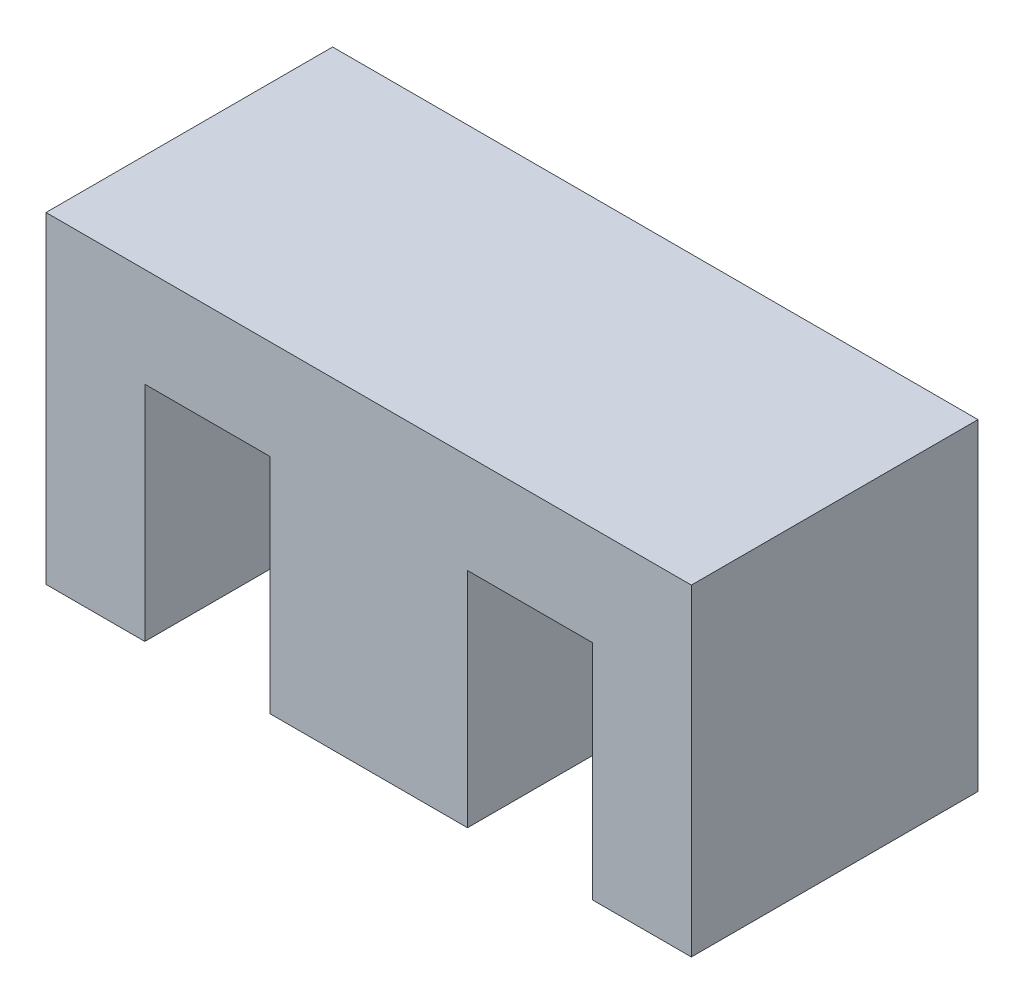
ISO-10303-21;
HEADER;
FILE_DESCRIPTION(('STEP AP214'),'2;1');
FILE_NAME('part.step','',(''),(''),'','','');
FILE_SCHEMA(('AUTOMOTIVE_DESIGN { 1 0 10303 214 1 1 1 1 }'));
ENDSEC;
DATA;
#1=APPLICATION_CONTEXT('core data for automotive mechanical design processes');
#2=APPLICATION_PROTOCOL_DEFINITION('international standard','automotive_design',2000,#1);
#3=PRODUCT_CONTEXT('',#1,'mechanical');
#4=PRODUCT('Part','Part','',(#3));
#5=PRODUCT_RELATED_PRODUCT_CATEGORY('part','',(#4));
#6=PRODUCT_DEFINITION_FORMATION('','',#4);
#7=PRODUCT_DEFINITION_CONTEXT('part definition',#1,'design');
#8=PRODUCT_DEFINITION('design','',#6,#7);
#9=PRODUCT_DEFINITION_SHAPE('','',#8);
#10=(LENGTH_UNIT() NAMED_UNIT(*) SI_UNIT(.MILLI.,.METRE.));
#11=(NAMED_UNIT(*) PLANE_ANGLE_UNIT() SI_UNIT($,.RADIAN.));
#12=(NAMED_UNIT(*) SI_UNIT($,.STERADIAN.) SOLID_ANGLE_UNIT());
#13=UNCERTAINTY_MEASURE_WITH_UNIT(LENGTH_MEASURE(1.E-05),#10,'distance_accuracy_value','');
#14=(GEOMETRIC_REPRESENTATION_CONTEXT(3) GLOBAL_UNCERTAINTY_ASSIGNED_CONTEXT((#13)) GLOBAL_UNIT_ASSIGNED_CONTEXT((#10,
#11,#12)) REPRESENTATION_CONTEXT('',''));
#15=CARTESIAN_POINT('',(0.,0.,0.));
#16=DIRECTION('',(0.,0.,1.));
#17=DIRECTION('',(1.,0.,0.));
#18=AXIS2_PLACEMENT_3D('',#15,#16,#17);
#19=CARTESIAN_POINT('',(-70.2201990393369,-26.5240919222679,24.65));
#20=DIRECTION('',(1.,0.,0.));
#21=DIRECTION('',(0.,1.,0.));
#22=AXIS2_PLACEMENT_3D('',#19,#20,#21);
#23=PLANE('',#22);
#24=DIRECTION('',(0.,-1.,0.));
#25=VECTOR('',#24,1.);
#26=CARTESIAN_POINT('',(-70.2201990393369,-26.5240919222679,0.));
#27=LINE('',#26,#25);
#28=CARTESIAN_POINT('',(-70.2201990393369,-26.5240919222679,0.));
#29=VERTEX_POINT('',#28);
#30=CARTESIAN_POINT('',(-70.2201990393369,-54.2240919222679,0.));
#31=VERTEX_POINT('',#30);
#32=EDGE_CURVE('E153',#29,#31,#27,.T.);
#33=ORIENTED_EDGE('',*,*,#32,.T.);
#34=DIRECTION('',(0.,0.,-1.));
#35=VECTOR('',#34,1.);
#36=CARTESIAN_POINT('',(-70.2201990393369,-54.2240919222679,24.65));
#37=LINE('',#36,#35);
#38=CARTESIAN_POINT('',(-70.2201990393369,-54.2240919222679,24.65));
#39=VERTEX_POINT('',#38);
#40=EDGE_CURVE('E11',#39,#31,#37,.T.);
#41=ORIENTED_EDGE('',*,*,#40,.F.);
#42=DIRECTION('',(0.,-1.,0.));
#43=VECTOR('',#42,1.);
#44=CARTESIAN_POINT('',(-70.2201990393369,-26.5240919222679,24.65));
#45=LINE('',#44,#43);
#46=CARTESIAN_POINT('',(-70.2201990393369,-26.5240919222679,24.65));
#47=VERTEX_POINT('',#46);
#48=EDGE_CURVE('E175',#47,#39,#45,.T.);
#49=ORIENTED_EDGE('',*,*,#48,.F.);
#50=DIRECTION('',(0.,0.,-1.));
#51=VECTOR('',#50,1.);
#52=CARTESIAN_POINT('',(-70.2201990393369,-26.5240919222679,24.65));
#53=LINE('',#52,#51);
#54=EDGE_CURVE('E149',#47,#29,#53,.T.);
#55=ORIENTED_EDGE('',*,*,#54,.T.);
#56=EDGE_LOOP('',(#33,#41,#49,#55));
#57=FACE_BOUND('',#56,.T.);
#58=ADVANCED_FACE('F33',(#57),#23,.F.);
#59=CARTESIAN_POINT('',(-70.2201990393369,-54.2240919222679,24.65));
#60=DIRECTION('',(0.,1.,0.));
#61=DIRECTION('',(0.,0.,1.));
#62=AXIS2_PLACEMENT_3D('',#59,#60,#61);
#63=PLANE('',#62);
#64=DIRECTION('',(1.,0.,0.));
#65=VECTOR('',#64,1.);
#66=CARTESIAN_POINT('',(-70.2201990393369,-54.2240919222679,0.));
#67=LINE('',#66,#65);
#68=CARTESIAN_POINT('',(-61.7201990393369,-54.2240919222679,0.));
#69=VERTEX_POINT('',#68);
#70=EDGE_CURVE('E156',#31,#69,#67,.T.);
#71=ORIENTED_EDGE('',*,*,#70,.T.);
#72=DIRECTION('',(0.,0.,-1.));
#73=VECTOR('',#72,1.);
#74=CARTESIAN_POINT('',(-61.7201990393369,-54.2240919222679,24.65));
#75=LINE('',#74,#73);
#76=CARTESIAN_POINT('',(-61.7201990393369,-54.2240919222679,24.65));
#77=VERTEX_POINT('',#76);
#78=EDGE_CURVE('E41',#77,#69,#75,.T.);
#79=ORIENTED_EDGE('',*,*,#78,.F.);
#80=DIRECTION('',(1.,0.,0.));
#81=VECTOR('',#80,1.);
#82=CARTESIAN_POINT('',(-70.2201990393369,-54.2240919222679,24.65));
#83=LINE('',#82,#81);
#84=EDGE_CURVE('E104',#39,#77,#83,.T.);
#85=ORIENTED_EDGE('',*,*,#84,.F.);
#86=ORIENTED_EDGE('',*,*,#40,.T.);
#87=EDGE_LOOP('',(#71,#79,#85,#86));
#88=FACE_BOUND('',#87,.T.);
#89=ADVANCED_FACE('F253',(#88),#63,.F.);
#90=CARTESIAN_POINT('',(-61.7201990393369,-35.0640919222679,24.65));
#91=DIRECTION('',(-1.,0.,0.));
#92=DIRECTION('',(0.,-1.,0.));
#93=AXIS2_PLACEMENT_3D('',#90,#91,#92);
#94=PLANE('',#93);
#95=DIRECTION('',(0.,1.,0.));
#96=VECTOR('',#95,1.);
#97=CARTESIAN_POINT('',(-61.7201990393369,-35.0640919222679,0.));
#98=LINE('',#97,#96);
#99=CARTESIAN_POINT('',(-61.7201990393369,-35.0640919222679,0.));
#100=VERTEX_POINT('',#99);
#101=EDGE_CURVE('E158',#69,#100,#98,.T.);
#102=ORIENTED_EDGE('',*,*,#101,.T.);
#103=DIRECTION('',(0.,0.,-1.));
#104=VECTOR('',#103,1.);
#105=CARTESIAN_POINT('',(-61.7201990393369,-35.0640919222679,24.65));
#106=LINE('',#105,#104);
#107=CARTESIAN_POINT('',(-61.7201990393369,-35.0640919222679,24.65));
#108=VERTEX_POINT('',#107);
#109=EDGE_CURVE('E194',#108,#100,#106,.T.);
#110=ORIENTED_EDGE('',*,*,#109,.F.);
#111=DIRECTION('',(0.,1.,0.));
#112=VECTOR('',#111,1.);
#113=CARTESIAN_POINT('',(-61.7201990393369,-35.0640919222679,24.65));
#114=LINE('',#113,#112);
#115=EDGE_CURVE('E202',#77,#108,#114,.T.);
#116=ORIENTED_EDGE('',*,*,#115,.F.);
#117=ORIENTED_EDGE('',*,*,#78,.T.);
#118=EDGE_LOOP('',(#102,#110,#116,#117));
#119=FACE_BOUND('',#118,.T.);
#120=ADVANCED_FACE('F200',(#119),#94,.F.);
#121=CARTESIAN_POINT('',(-61.7201990393369,-35.0640919222679,24.65));
#122=DIRECTION('',(0.,1.,0.));
#123=DIRECTION('',(0.,0.,1.));
#124=AXIS2_PLACEMENT_3D('',#121,#122,#123);
#125=PLANE('',#124);
#126=DIRECTION('',(1.,0.,0.));
#127=VECTOR('',#126,1.);
#128=CARTESIAN_POINT('',(-61.7201990393369,-35.0640919222679,0.));
#129=LINE('',#128,#127);
#130=CARTESIAN_POINT('',(-50.9701990393369,-35.0640919222679,0.));
#131=VERTEX_POINT('',#130);
#132=EDGE_CURVE('E160',#100,#131,#129,.T.);
#133=ORIENTED_EDGE('',*,*,#132,.T.);
#134=DIRECTION('',(0.,0.,-1.));
#135=VECTOR('',#134,1.);
#136=CARTESIAN_POINT('',(-50.9701990393369,-35.0640919222679,24.65));
#137=LINE('',#136,#135);
#138=CARTESIAN_POINT('',(-50.9701990393369,-35.0640919222679,24.65));
#139=VERTEX_POINT('',#138);
#140=EDGE_CURVE('E191',#139,#131,#137,.T.);
#141=ORIENTED_EDGE('',*,*,#140,.F.);
#142=DIRECTION('',(1.,0.,0.));
#143=VECTOR('',#142,1.);
#144=CARTESIAN_POINT('',(-61.7201990393369,-35.0640919222679,24.65));
#145=LINE('',#144,#143);
#146=EDGE_CURVE('E220',#108,#139,#145,.T.);
#147=ORIENTED_EDGE('',*,*,#146,.F.);
#148=ORIENTED_EDGE('',*,*,#109,.T.);
#149=EDGE_LOOP('',(#133,#141,#147,#148));
#150=FACE_BOUND('',#149,.T.);
#151=ADVANCED_FACE('F211',(#150),#125,.F.);
#152=CARTESIAN_POINT('',(-50.9701990393369,-35.0640919222679,24.65));
#153=DIRECTION('',(1.,0.,0.));
#154=DIRECTION('',(0.,1.,0.));
#155=AXIS2_PLACEMENT_3D('',#152,#153,#154);
#156=PLANE('',#155);
#157=DIRECTION('',(0.,-1.,0.));
#158=VECTOR('',#157,1.);
#159=CARTESIAN_POINT('',(-50.9701990393369,-35.0640919222679,0.));
#160=LINE('',#159,#158);
#161=CARTESIAN_POINT('',(-50.9701990393369,-54.2240919222679,0.));
#162=VERTEX_POINT('',#161);
#163=EDGE_CURVE('E162',#131,#162,#160,.T.);
#164=ORIENTED_EDGE('',*,*,#163,.T.);
#165=DIRECTION('',(0.,0.,-1.));
#166=VECTOR('',#165,1.);
#167=CARTESIAN_POINT('',(-50.9701990393369,-54.2240919222679,24.65));
#168=LINE('',#167,#166);
#169=CARTESIAN_POINT('',(-50.9701990393369,-54.2240919222679,24.65));
#170=VERTEX_POINT('',#169);
#171=EDGE_CURVE('E188',#170,#162,#168,.T.);
#172=ORIENTED_EDGE('',*,*,#171,.F.);
#173=DIRECTION('',(0.,-1.,0.));
#174=VECTOR('',#173,1.);
#175=CARTESIAN_POINT('',(-50.9701990393369,-35.0640919222679,24.65));
#176=LINE('',#175,#174);
#177=EDGE_CURVE('E217',#139,#170,#176,.T.);
#178=ORIENTED_EDGE('',*,*,#177,.F.);
#179=ORIENTED_EDGE('',*,*,#140,.T.);
#180=EDGE_LOOP('',(#164,#172,#178,#179));
#181=FACE_BOUND('',#180,.T.);
#182=ADVANCED_FACE('F215',(#181),#156,.F.);
#183=CARTESIAN_POINT('',(-50.9701990393369,-54.2240919222679,24.65));
#184=DIRECTION('',(0.,1.,0.));
#185=DIRECTION('',(0.,0.,1.));
#186=AXIS2_PLACEMENT_3D('',#183,#184,#185);
#187=PLANE('',#186);
#188=DIRECTION('',(1.,0.,0.));
#189=VECTOR('',#188,1.);
#190=CARTESIAN_POINT('',(-50.9701990393369,-54.2240919222679,0.));
#191=LINE('',#190,#189);
#192=CARTESIAN_POINT('',(-33.9701990393369,-54.2240919222679,0.));
#193=VERTEX_POINT('',#192);
#194=EDGE_CURVE('E164',#162,#193,#191,.T.);
#195=ORIENTED_EDGE('',*,*,#194,.T.);
#196=DIRECTION('',(0.,0.,-1.));
#197=VECTOR('',#196,1.);
#198=CARTESIAN_POINT('',(-33.9701990393369,-54.2240919222679,24.65));
#199=LINE('',#198,#197);
#200=CARTESIAN_POINT('',(-33.9701990393369,-54.2240919222679,24.65));
#201=VERTEX_POINT('',#200);
#202=EDGE_CURVE('E185',#201,#193,#199,.T.);
#203=ORIENTED_EDGE('',*,*,#202,.F.);
#204=DIRECTION('',(1.,0.,0.));
#205=VECTOR('',#204,1.);
#206=CARTESIAN_POINT('',(-50.9701990393369,-54.2240919222679,24.65));
#207=LINE('',#206,#205);
#208=EDGE_CURVE('E219',#170,#201,#207,.T.);
#209=ORIENTED_EDGE('',*,*,#208,.F.);
#210=ORIENTED_EDGE('',*,*,#171,.T.);
#211=EDGE_LOOP('',(#195,#203,#209,#210));
#212=FACE_BOUND('',#211,.T.);
#213=ADVANCED_FACE('F266',(#212),#187,.F.);
#214=CARTESIAN_POINT('',(-33.9701990393369,-35.0640919222679,24.65));
#215=DIRECTION('',(-1.,0.,0.));
#216=DIRECTION('',(0.,-1.,0.));
#217=AXIS2_PLACEMENT_3D('',#214,#215,#216);
#218=PLANE('',#217);
#219=DIRECTION('',(0.,1.,0.));
#220=VECTOR('',#219,1.);
#221=CARTESIAN_POINT('',(-33.9701990393369,-35.0640919222679,0.));
#222=LINE('',#221,#220);
#223=CARTESIAN_POINT('',(-33.9701990393369,-35.0640919222679,0.));
#224=VERTEX_POINT('',#223);
#225=EDGE_CURVE('E166',#193,#224,#222,.T.);
#226=ORIENTED_EDGE('',*,*,#225,.T.);
#227=DIRECTION('',(0.,0.,-1.));
#228=VECTOR('',#227,1.);
#229=CARTESIAN_POINT('',(-33.9701990393369,-35.0640919222679,24.65));
#230=LINE('',#229,#228);
#231=CARTESIAN_POINT('',(-33.9701990393369,-35.0640919222679,24.65));
#232=VERTEX_POINT('',#231);
#233=EDGE_CURVE('E182',#232,#224,#230,.T.);
#234=ORIENTED_EDGE('',*,*,#233,.F.);
#235=DIRECTION('',(0.,1.,0.));
#236=VECTOR('',#235,1.);
#237=CARTESIAN_POINT('',(-33.9701990393369,-35.0640919222679,24.65));
#238=LINE('',#237,#236);
#239=EDGE_CURVE('E222',#201,#232,#238,.T.);
#240=ORIENTED_EDGE('',*,*,#239,.F.);
#241=ORIENTED_EDGE('',*,*,#202,.T.);
#242=EDGE_LOOP('',(#226,#234,#240,#241));
#243=FACE_BOUND('',#242,.T.);
#244=ADVANCED_FACE('F269',(#243),#218,.F.);
#245=CARTESIAN_POINT('',(-33.9701990393369,-35.0640919222679,24.65));
#246=DIRECTION('',(0.,1.,0.));
#247=DIRECTION('',(0.,0.,1.));
#248=AXIS2_PLACEMENT_3D('',#245,#246,#247);
#249=PLANE('',#248);
#250=DIRECTION('',(1.,0.,0.));
#251=VECTOR('',#250,1.);
#252=CARTESIAN_POINT('',(-33.9701990393369,-35.0640919222679,0.));
#253=LINE('',#252,#251);
#254=CARTESIAN_POINT('',(-23.2201990393369,-35.0640919222679,0.));
#255=VERTEX_POINT('',#254);
#256=EDGE_CURVE('E168',#224,#255,#253,.T.);
#257=ORIENTED_EDGE('',*,*,#256,.T.);
#258=DIRECTION('',(0.,0.,-1.));
#259=VECTOR('',#258,1.);
#260=CARTESIAN_POINT('',(-23.2201990393369,-35.0640919222679,24.65));
#261=LINE('',#260,#259);
#262=CARTESIAN_POINT('',(-23.2201990393369,-35.0640919222679,24.65));
#263=VERTEX_POINT('',#262);
#264=EDGE_CURVE('E179',#263,#255,#261,.T.);
#265=ORIENTED_EDGE('',*,*,#264,.F.);
#266=DIRECTION('',(1.,0.,0.));
#267=VECTOR('',#266,1.);
#268=CARTESIAN_POINT('',(-33.9701990393369,-35.0640919222679,24.65));
#269=LINE('',#268,#267);
#270=EDGE_CURVE('E228',#232,#263,#269,.T.);
#271=ORIENTED_EDGE('',*,*,#270,.F.);
#272=ORIENTED_EDGE('',*,*,#233,.T.);
#273=EDGE_LOOP('',(#257,#265,#271,#272));
#274=FACE_BOUND('',#273,.T.);
#275=ADVANCED_FACE('F234',(#274),#249,.F.);
#276=CARTESIAN_POINT('',(-23.2201990393369,-35.0640919222679,24.65));
#277=DIRECTION('',(1.,0.,0.));
#278=DIRECTION('',(0.,1.,0.));
#279=AXIS2_PLACEMENT_3D('',#276,#277,#278);
#280=PLANE('',#279);
#281=DIRECTION('',(0.,-1.,0.));
#282=VECTOR('',#281,1.);
#283=CARTESIAN_POINT('',(-23.2201990393369,-35.0640919222679,0.));
#284=LINE('',#283,#282);
#285=CARTESIAN_POINT('',(-23.2201990393369,-54.2240919222679,0.));
#286=VERTEX_POINT('',#285);
#287=EDGE_CURVE('E170',#255,#286,#284,.T.);
#288=ORIENTED_EDGE('',*,*,#287,.T.);
#289=DIRECTION('',(0.,0.,-1.));
#290=VECTOR('',#289,1.);
#291=CARTESIAN_POINT('',(-23.2201990393369,-54.2240919222679,24.65));
#292=LINE('',#291,#290);
#293=CARTESIAN_POINT('',(-23.2201990393369,-54.2240919222679,24.65));
#294=VERTEX_POINT('',#293);
#295=EDGE_CURVE('E144',#294,#286,#292,.T.);
#296=ORIENTED_EDGE('',*,*,#295,.F.);
#297=DIRECTION('',(0.,-1.,0.));
#298=VECTOR('',#297,1.);
#299=CARTESIAN_POINT('',(-23.2201990393369,-35.0640919222679,24.65));
#300=LINE('',#299,#298);
#301=EDGE_CURVE('E135',#263,#294,#300,.T.);
#302=ORIENTED_EDGE('',*,*,#301,.F.);
#303=ORIENTED_EDGE('',*,*,#264,.T.);
#304=EDGE_LOOP('',(#288,#296,#302,#303));
#305=FACE_BOUND('',#304,.T.);
#306=ADVANCED_FACE('F238',(#305),#280,.F.);
#307=CARTESIAN_POINT('',(-23.2201990393369,-54.2240919222679,24.65));
#308=DIRECTION('',(0.,1.,0.));
#309=DIRECTION('',(0.,0.,1.));
#310=AXIS2_PLACEMENT_3D('',#307,#308,#309);
#311=PLANE('',#310);
#312=DIRECTION('',(1.,0.,0.));
#313=VECTOR('',#312,1.);
#314=CARTESIAN_POINT('',(-23.2201990393369,-54.2240919222679,0.));
#315=LINE('',#314,#313);
#316=CARTESIAN_POINT('',(-14.7201990393369,-54.2240919222679,0.));
#317=VERTEX_POINT('',#316);
#318=EDGE_CURVE('E143',#286,#317,#315,.T.);
#319=ORIENTED_EDGE('',*,*,#318,.T.);
#320=DIRECTION('',(0.,0.,-1.));
#321=VECTOR('',#320,1.);
#322=CARTESIAN_POINT('',(-14.7201990393369,-54.2240919222679,24.65));
#323=LINE('',#322,#321);
#324=CARTESIAN_POINT('',(-14.7201990393369,-54.2240919222679,24.65));
#325=VERTEX_POINT('',#324);
#326=EDGE_CURVE('E140',#325,#317,#323,.T.);
#327=ORIENTED_EDGE('',*,*,#326,.F.);
#328=DIRECTION('',(1.,0.,0.));
#329=VECTOR('',#328,1.);
#330=CARTESIAN_POINT('',(-23.2201990393369,-54.2240919222679,24.65));
#331=LINE('',#330,#329);
#332=EDGE_CURVE('E129',#294,#325,#331,.T.);
#333=ORIENTED_EDGE('',*,*,#332,.F.);
#334=ORIENTED_EDGE('',*,*,#295,.T.);
#335=EDGE_LOOP('',(#319,#327,#333,#334));
#336=FACE_BOUND('',#335,.T.);
#337=ADVANCED_FACE('F141',(#336),#311,.F.);
#338=CARTESIAN_POINT('',(-14.7201990393369,-26.5240919222679,24.65));
#339=DIRECTION('',(-1.,0.,0.));
#340=DIRECTION('',(0.,0.,1.));
#341=AXIS2_PLACEMENT_3D('',#338,#339,#340);
#342=PLANE('',#341);
#343=DIRECTION('',(0.,1.,0.));
#344=VECTOR('',#343,1.);
#345=CARTESIAN_POINT('',(-14.7201990393369,-26.5240919222679,0.));
#346=LINE('',#345,#344);
#347=CARTESIAN_POINT('',(-14.7201990393369,-26.5240919222679,0.));
#348=VERTEX_POINT('',#347);
#349=EDGE_CURVE('E90',#317,#348,#346,.T.);
#350=ORIENTED_EDGE('',*,*,#349,.T.);
#351=DIRECTION('',(0.,0.,-1.));
#352=VECTOR('',#351,1.);
#353=CARTESIAN_POINT('',(-14.7201990393369,-26.5240919222679,24.65));
#354=LINE('',#353,#352);
#355=CARTESIAN_POINT('',(-14.7201990393369,-26.5240919222679,24.65));
#356=VERTEX_POINT('',#355);
#357=EDGE_CURVE('E145',#356,#348,#354,.T.);
#358=ORIENTED_EDGE('',*,*,#357,.F.);
#359=DIRECTION('',(0.,1.,0.));
#360=VECTOR('',#359,1.);
#361=CARTESIAN_POINT('',(-14.7201990393369,-26.5240919222679,24.65));
#362=LINE('',#361,#360);
#363=EDGE_CURVE('E133',#325,#356,#362,.T.);
#364=ORIENTED_EDGE('',*,*,#363,.F.);
#365=ORIENTED_EDGE('',*,*,#326,.T.);
#366=EDGE_LOOP('',(#350,#358,#364,#365));
#367=FACE_BOUND('',#366,.T.);
#368=ADVANCED_FACE('F147',(#367),#342,.F.);
#369=CARTESIAN_POINT('',(-70.2201990393369,-26.5240919222679,24.65));
#370=DIRECTION('',(0.,-1.,0.));
#371=DIRECTION('',(0.,0.,-1.));
#372=AXIS2_PLACEMENT_3D('',#369,#370,#371);
#373=PLANE('',#372);
#374=DIRECTION('',(-1.,0.,0.));
#375=VECTOR('',#374,1.);
#376=CARTESIAN_POINT('',(-70.2201990393369,-26.5240919222679,0.));
#377=LINE('',#376,#375);
#378=EDGE_CURVE('E96',#348,#29,#377,.T.);
#379=ORIENTED_EDGE('',*,*,#378,.T.);
#380=ORIENTED_EDGE('',*,*,#54,.F.);
#381=DIRECTION('',(-1.,0.,0.));
#382=VECTOR('',#381,1.);
#383=CARTESIAN_POINT('',(-70.2201990393369,-26.5240919222679,24.65));
#384=LINE('',#383,#382);
#385=EDGE_CURVE('E49',#356,#47,#384,.T.);
#386=ORIENTED_EDGE('',*,*,#385,.F.);
#387=ORIENTED_EDGE('',*,*,#357,.T.);
#388=EDGE_LOOP('',(#379,#380,#386,#387));
#389=FACE_BOUND('',#388,.T.);
#390=ADVANCED_FACE('F242',(#389),#373,.F.);
#391=CARTESIAN_POINT('',(0.,0.,24.65));
#392=DIRECTION('',(0.,0.,1.));
#393=DIRECTION('',(1.,0.,0.));
#394=AXIS2_PLACEMENT_3D('',#391,#392,#393);
#395=PLANE('',#394);
#396=ORIENTED_EDGE('',*,*,#48,.T.);
#397=ORIENTED_EDGE('',*,*,#84,.T.);
#398=ORIENTED_EDGE('',*,*,#115,.T.);
#399=ORIENTED_EDGE('',*,*,#146,.T.);
#400=ORIENTED_EDGE('',*,*,#177,.T.);
#401=ORIENTED_EDGE('',*,*,#208,.T.);
#402=ORIENTED_EDGE('',*,*,#239,.T.);
#403=ORIENTED_EDGE('',*,*,#270,.T.);
#404=ORIENTED_EDGE('',*,*,#301,.T.);
#405=ORIENTED_EDGE('',*,*,#332,.T.);
#406=ORIENTED_EDGE('',*,*,#363,.T.);
#407=ORIENTED_EDGE('',*,*,#385,.T.);
#408=EDGE_LOOP('',(#396,#397,#398,#399,#400,#401,#402,#403,#404,#405,#406,#407));
#409=FACE_BOUND('',#408,.T.);
#410=ADVANCED_FACE('F131',(#409),#395,.T.);
#411=CARTESIAN_POINT('',(0.,0.,0.));
#412=DIRECTION('',(0.,0.,1.));
#413=DIRECTION('',(1.,0.,0.));
#414=AXIS2_PLACEMENT_3D('',#411,#412,#413);
#415=PLANE('',#414);
#416=ORIENTED_EDGE('',*,*,#32,.F.);
#417=ORIENTED_EDGE('',*,*,#378,.F.);
#418=ORIENTED_EDGE('',*,*,#349,.F.);
#419=ORIENTED_EDGE('',*,*,#318,.F.);
#420=ORIENTED_EDGE('',*,*,#287,.F.);
#421=ORIENTED_EDGE('',*,*,#256,.F.);
#422=ORIENTED_EDGE('',*,*,#225,.F.);
#423=ORIENTED_EDGE('',*,*,#194,.F.);
#424=ORIENTED_EDGE('',*,*,#163,.F.);
#425=ORIENTED_EDGE('',*,*,#132,.F.);
#426=ORIENTED_EDGE('',*,*,#101,.F.);
#427=ORIENTED_EDGE('',*,*,#70,.F.);
#428=EDGE_LOOP('',(#416,#417,#418,#419,#420,#421,#422,#423,#424,#425,#426,#427));
#429=FACE_BOUND('',#428,.T.);
#430=ADVANCED_FACE('F206',(#429),#415,.F.);
#431=CLOSED_SHELL('',(#58,#89,#120,#151,#182,#213,#244,#275,#306,#337,#368,#390,#410,#430));
#432=MANIFOLD_SOLID_BREP('B2',#431);
#433=ADVANCED_BREP_SHAPE_REPRESENTATION('',(#18,#432),#14);
#434=SHAPE_DEFINITION_REPRESENTATION(#9,#433);
ENDSEC;
END-ISO-10303-21;
